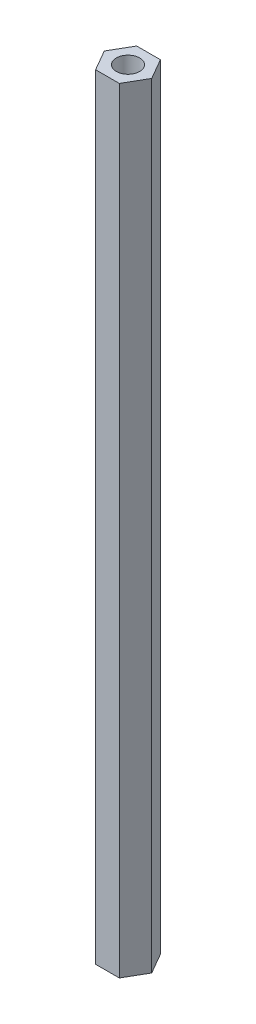
ISO-10303-21;
HEADER;
FILE_DESCRIPTION(('STEP AP214'),'2;1');
FILE_NAME('part.step','',(''),(''),'','','');
FILE_SCHEMA(('AUTOMOTIVE_DESIGN { 1 0 10303 214 1 1 1 1 }'));
ENDSEC;
DATA;
#1=APPLICATION_CONTEXT('core data for automotive mechanical design processes');
#2=APPLICATION_PROTOCOL_DEFINITION('international standard','automotive_design',2000,#1);
#3=PRODUCT_CONTEXT('',#1,'mechanical');
#4=PRODUCT('Part','Part','',(#3));
#5=PRODUCT_RELATED_PRODUCT_CATEGORY('part','',(#4));
#6=PRODUCT_DEFINITION_FORMATION('','',#4);
#7=PRODUCT_DEFINITION_CONTEXT('part definition',#1,'design');
#8=PRODUCT_DEFINITION('design','',#6,#7);
#9=PRODUCT_DEFINITION_SHAPE('','',#8);
#10=(LENGTH_UNIT() NAMED_UNIT(*) SI_UNIT(.MILLI.,.METRE.));
#11=(NAMED_UNIT(*) PLANE_ANGLE_UNIT() SI_UNIT($,.RADIAN.));
#12=(NAMED_UNIT(*) SI_UNIT($,.STERADIAN.) SOLID_ANGLE_UNIT());
#13=UNCERTAINTY_MEASURE_WITH_UNIT(LENGTH_MEASURE(1.E-05),#10,'distance_accuracy_value','');
#14=(GEOMETRIC_REPRESENTATION_CONTEXT(3) GLOBAL_UNCERTAINTY_ASSIGNED_CONTEXT((#13)) GLOBAL_UNIT_ASSIGNED_CONTEXT((#10,
#11,#12)) REPRESENTATION_CONTEXT('',''));
#15=CARTESIAN_POINT('',(0.,0.,0.));
#16=DIRECTION('',(0.,0.,1.));
#17=DIRECTION('',(1.,0.,0.));
#18=AXIS2_PLACEMENT_3D('',#15,#16,#17);
#19=CARTESIAN_POINT('',(0.,132.,0.));
#20=DIRECTION('',(0.,1.,0.));
#21=DIRECTION('',(0.,0.,1.));
#22=AXIS2_PLACEMENT_3D('',#19,#20,#21);
#23=PLANE('',#22);
#24=DIRECTION('',(0.499999999999999,0.,-0.866025403784439));
#25=VECTOR('',#24,1.);
#26=CARTESIAN_POINT('',(2.02072594216369,132.,3.5));
#27=LINE('',#26,#25);
#28=CARTESIAN_POINT('',(2.02072594216369,132.,3.5));
#29=VERTEX_POINT('',#28);
#30=CARTESIAN_POINT('',(4.04145188432738,132.,0.));
#31=VERTEX_POINT('',#30);
#32=EDGE_CURVE('E152',#29,#31,#27,.T.);
#33=ORIENTED_EDGE('',*,*,#32,.T.);
#34=DIRECTION('',(-0.5,0.,-0.866025403784438));
#35=VECTOR('',#34,1.);
#36=CARTESIAN_POINT('',(4.04145188432738,132.,0.));
#37=LINE('',#36,#35);
#38=CARTESIAN_POINT('',(2.02072594216369,132.,-3.5));
#39=VERTEX_POINT('',#38);
#40=EDGE_CURVE('E100',#31,#39,#37,.T.);
#41=ORIENTED_EDGE('',*,*,#40,.T.);
#42=DIRECTION('',(-1.,0.,0.));
#43=VECTOR('',#42,1.);
#44=CARTESIAN_POINT('',(2.02072594216369,132.,-3.5));
#45=LINE('',#44,#43);
#46=CARTESIAN_POINT('',(-2.02072594216369,132.,-3.5));
#47=VERTEX_POINT('',#46);
#48=EDGE_CURVE('E113',#39,#47,#45,.T.);
#49=ORIENTED_EDGE('',*,*,#48,.T.);
#50=DIRECTION('',(-0.5,0.,0.866025403784439));
#51=VECTOR('',#50,1.);
#52=CARTESIAN_POINT('',(-2.02072594216369,132.,-3.5));
#53=LINE('',#52,#51);
#54=CARTESIAN_POINT('',(-4.04145188432738,132.,0.));
#55=VERTEX_POINT('',#54);
#56=EDGE_CURVE('E107',#47,#55,#53,.T.);
#57=ORIENTED_EDGE('',*,*,#56,.T.);
#58=DIRECTION('',(0.5,0.,0.866025403784439));
#59=VECTOR('',#58,1.);
#60=CARTESIAN_POINT('',(-4.04145188432738,132.,0.));
#61=LINE('',#60,#59);
#62=CARTESIAN_POINT('',(-2.02072594216369,132.,3.5));
#63=VERTEX_POINT('',#62);
#64=EDGE_CURVE('E111',#55,#63,#61,.T.);
#65=ORIENTED_EDGE('',*,*,#64,.T.);
#66=DIRECTION('',(1.,0.,0.));
#67=VECTOR('',#66,1.);
#68=CARTESIAN_POINT('',(-2.02072594216369,132.,3.5));
#69=LINE('',#68,#67);
#70=EDGE_CURVE('E63',#63,#29,#69,.T.);
#71=ORIENTED_EDGE('',*,*,#70,.T.);
#72=EDGE_LOOP('',(#33,#41,#49,#57,#65,#71));
#73=FACE_BOUND('',#72,.T.);
#74=CARTESIAN_POINT('',(0.,132.,0.));
#75=DIRECTION('',(0.,1.,0.));
#76=DIRECTION('',(0.,0.,1.));
#77=AXIS2_PLACEMENT_3D('',#74,#75,#76);
#78=CIRCLE('',#77,2.);
#79=CARTESIAN_POINT('',(0.,132.,2.));
#80=VERTEX_POINT('',#79);
#81=EDGE_CURVE('E140',#80,#80,#78,.T.);
#82=ORIENTED_EDGE('',*,*,#81,.F.);
#83=EDGE_LOOP('',(#82));
#84=FACE_BOUND('',#83,.T.);
#85=ADVANCED_FACE('F45',(#73,#84),#23,.T.);
#86=CARTESIAN_POINT('',(0.,0.,0.));
#87=DIRECTION('',(0.,1.,0.));
#88=DIRECTION('',(0.,0.,1.));
#89=AXIS2_PLACEMENT_3D('',#86,#87,#88);
#90=PLANE('',#89);
#91=DIRECTION('',(0.499999999999999,0.,-0.866025403784439));
#92=VECTOR('',#91,1.);
#93=CARTESIAN_POINT('',(2.02072594216369,0.,3.5));
#94=LINE('',#93,#92);
#95=CARTESIAN_POINT('',(2.02072594216369,0.,3.5));
#96=VERTEX_POINT('',#95);
#97=CARTESIAN_POINT('',(4.04145188432738,0.,0.));
#98=VERTEX_POINT('',#97);
#99=EDGE_CURVE('E135',#96,#98,#94,.T.);
#100=ORIENTED_EDGE('',*,*,#99,.F.);
#101=DIRECTION('',(1.,0.,0.));
#102=VECTOR('',#101,1.);
#103=CARTESIAN_POINT('',(-2.02072594216369,0.,3.5));
#104=LINE('',#103,#102);
#105=CARTESIAN_POINT('',(-2.02072594216369,0.,3.5));
#106=VERTEX_POINT('',#105);
#107=EDGE_CURVE('E92',#106,#96,#104,.T.);
#108=ORIENTED_EDGE('',*,*,#107,.F.);
#109=DIRECTION('',(0.5,0.,0.866025403784439));
#110=VECTOR('',#109,1.);
#111=CARTESIAN_POINT('',(-4.04145188432738,0.,0.));
#112=LINE('',#111,#110);
#113=CARTESIAN_POINT('',(-4.04145188432738,0.,0.));
#114=VERTEX_POINT('',#113);
#115=EDGE_CURVE('E86',#114,#106,#112,.T.);
#116=ORIENTED_EDGE('',*,*,#115,.F.);
#117=DIRECTION('',(-0.5,0.,0.866025403784439));
#118=VECTOR('',#117,1.);
#119=CARTESIAN_POINT('',(-2.02072594216369,0.,-3.5));
#120=LINE('',#119,#118);
#121=CARTESIAN_POINT('',(-2.02072594216369,0.,-3.5));
#122=VERTEX_POINT('',#121);
#123=EDGE_CURVE('E122',#122,#114,#120,.T.);
#124=ORIENTED_EDGE('',*,*,#123,.F.);
#125=DIRECTION('',(-1.,0.,0.));
#126=VECTOR('',#125,1.);
#127=CARTESIAN_POINT('',(2.02072594216369,0.,-3.5));
#128=LINE('',#127,#126);
#129=CARTESIAN_POINT('',(2.02072594216369,0.,-3.5));
#130=VERTEX_POINT('',#129);
#131=EDGE_CURVE('E143',#130,#122,#128,.T.);
#132=ORIENTED_EDGE('',*,*,#131,.F.);
#133=DIRECTION('',(-0.5,0.,-0.866025403784438));
#134=VECTOR('',#133,1.);
#135=CARTESIAN_POINT('',(4.04145188432738,0.,0.));
#136=LINE('',#135,#134);
#137=EDGE_CURVE('E139',#98,#130,#136,.T.);
#138=ORIENTED_EDGE('',*,*,#137,.F.);
#139=EDGE_LOOP('',(#100,#108,#116,#124,#132,#138));
#140=FACE_BOUND('',#139,.T.);
#141=CARTESIAN_POINT('',(0.,0.,0.));
#142=DIRECTION('',(0.,1.,0.));
#143=DIRECTION('',(0.,0.,1.));
#144=AXIS2_PLACEMENT_3D('',#141,#142,#143);
#145=CIRCLE('',#144,2.);
#146=CARTESIAN_POINT('',(0.,0.,2.));
#147=VERTEX_POINT('',#146);
#148=EDGE_CURVE('E249',#147,#147,#145,.T.);
#149=ORIENTED_EDGE('',*,*,#148,.T.);
#150=EDGE_LOOP('',(#149));
#151=FACE_BOUND('',#150,.T.);
#152=ADVANCED_FACE('F165',(#140,#151),#90,.F.);
#153=CARTESIAN_POINT('',(2.02072594216369,132.,3.5));
#154=DIRECTION('',(-0.866025403784439,0.,-0.499999999999999));
#155=DIRECTION('',(-0.499999999999999,0.,0.866025403784439));
#156=AXIS2_PLACEMENT_3D('',#153,#154,#155);
#157=PLANE('',#156);
#158=ORIENTED_EDGE('',*,*,#99,.T.);
#159=DIRECTION('',(0.,-1.,0.));
#160=VECTOR('',#159,1.);
#161=CARTESIAN_POINT('',(4.04145188432738,132.,0.));
#162=LINE('',#161,#160);
#163=EDGE_CURVE('E11',#31,#98,#162,.T.);
#164=ORIENTED_EDGE('',*,*,#163,.F.);
#165=ORIENTED_EDGE('',*,*,#32,.F.);
#166=DIRECTION('',(0.,-1.,0.));
#167=VECTOR('',#166,1.);
#168=CARTESIAN_POINT('',(2.02072594216369,132.,3.5));
#169=LINE('',#168,#167);
#170=EDGE_CURVE('E131',#29,#96,#169,.T.);
#171=ORIENTED_EDGE('',*,*,#170,.T.);
#172=EDGE_LOOP('',(#158,#164,#165,#171));
#173=FACE_BOUND('',#172,.T.);
#174=ADVANCED_FACE('F47',(#173),#157,.F.);
#175=CARTESIAN_POINT('',(4.04145188432738,132.,0.));
#176=DIRECTION('',(-0.866025403784439,0.,0.5));
#177=DIRECTION('',(0.5,0.,0.866025403784439));
#178=AXIS2_PLACEMENT_3D('',#175,#176,#177);
#179=PLANE('',#178);
#180=ORIENTED_EDGE('',*,*,#137,.T.);
#181=DIRECTION('',(0.,-1.,0.));
#182=VECTOR('',#181,1.);
#183=CARTESIAN_POINT('',(2.02072594216369,132.,-3.5));
#184=LINE('',#183,#182);
#185=EDGE_CURVE('E55',#39,#130,#184,.T.);
#186=ORIENTED_EDGE('',*,*,#185,.F.);
#187=ORIENTED_EDGE('',*,*,#40,.F.);
#188=ORIENTED_EDGE('',*,*,#163,.T.);
#189=EDGE_LOOP('',(#180,#186,#187,#188));
#190=FACE_BOUND('',#189,.T.);
#191=ADVANCED_FACE('F190',(#190),#179,.F.);
#192=CARTESIAN_POINT('',(2.02072594216369,132.,-3.5));
#193=DIRECTION('',(0.,0.,1.));
#194=DIRECTION('',(1.,0.,0.));
#195=AXIS2_PLACEMENT_3D('',#192,#193,#194);
#196=PLANE('',#195);
#197=ORIENTED_EDGE('',*,*,#131,.T.);
#198=DIRECTION('',(0.,-1.,0.));
#199=VECTOR('',#198,1.);
#200=CARTESIAN_POINT('',(-2.02072594216369,132.,-3.5));
#201=LINE('',#200,#199);
#202=EDGE_CURVE('E124',#47,#122,#201,.T.);
#203=ORIENTED_EDGE('',*,*,#202,.F.);
#204=ORIENTED_EDGE('',*,*,#48,.F.);
#205=ORIENTED_EDGE('',*,*,#185,.T.);
#206=EDGE_LOOP('',(#197,#203,#204,#205));
#207=FACE_BOUND('',#206,.T.);
#208=ADVANCED_FACE('F162',(#207),#196,.F.);
#209=CARTESIAN_POINT('',(-2.02072594216369,132.,-3.5));
#210=DIRECTION('',(0.866025403784439,0.,0.499999999999999));
#211=DIRECTION('',(0.5,0.,-0.866025403784439));
#212=AXIS2_PLACEMENT_3D('',#209,#210,#211);
#213=PLANE('',#212);
#214=ORIENTED_EDGE('',*,*,#123,.T.);
#215=DIRECTION('',(0.,-1.,0.));
#216=VECTOR('',#215,1.);
#217=CARTESIAN_POINT('',(-4.04145188432738,132.,0.));
#218=LINE('',#217,#216);
#219=EDGE_CURVE('E119',#55,#114,#218,.T.);
#220=ORIENTED_EDGE('',*,*,#219,.F.);
#221=ORIENTED_EDGE('',*,*,#56,.F.);
#222=ORIENTED_EDGE('',*,*,#202,.T.);
#223=EDGE_LOOP('',(#214,#220,#221,#222));
#224=FACE_BOUND('',#223,.T.);
#225=ADVANCED_FACE('F120',(#224),#213,.F.);
#226=CARTESIAN_POINT('',(-4.04145188432738,132.,0.));
#227=DIRECTION('',(0.866025403784439,0.,-0.5));
#228=DIRECTION('',(-0.5,0.,-0.866025403784439));
#229=AXIS2_PLACEMENT_3D('',#226,#227,#228);
#230=PLANE('',#229);
#231=ORIENTED_EDGE('',*,*,#115,.T.);
#232=DIRECTION('',(0.,-1.,0.));
#233=VECTOR('',#232,1.);
#234=CARTESIAN_POINT('',(-2.02072594216369,132.,3.5));
#235=LINE('',#234,#233);
#236=EDGE_CURVE('E125',#63,#106,#235,.T.);
#237=ORIENTED_EDGE('',*,*,#236,.F.);
#238=ORIENTED_EDGE('',*,*,#64,.F.);
#239=ORIENTED_EDGE('',*,*,#219,.T.);
#240=EDGE_LOOP('',(#231,#237,#238,#239));
#241=FACE_BOUND('',#240,.T.);
#242=ADVANCED_FACE('F127',(#241),#230,.F.);
#243=CARTESIAN_POINT('',(-2.02072594216369,132.,3.5));
#244=DIRECTION('',(0.,0.,-1.));
#245=DIRECTION('',(-1.,0.,0.));
#246=AXIS2_PLACEMENT_3D('',#243,#244,#245);
#247=PLANE('',#246);
#248=ORIENTED_EDGE('',*,*,#107,.T.);
#249=ORIENTED_EDGE('',*,*,#170,.F.);
#250=ORIENTED_EDGE('',*,*,#70,.F.);
#251=ORIENTED_EDGE('',*,*,#236,.T.);
#252=EDGE_LOOP('',(#248,#249,#250,#251));
#253=FACE_BOUND('',#252,.T.);
#254=ADVANCED_FACE('F170',(#253),#247,.F.);
#255=CARTESIAN_POINT('',(0.,132.,0.));
#256=DIRECTION('',(0.,-1.,0.));
#257=DIRECTION('',(0.,0.,-1.));
#258=AXIS2_PLACEMENT_3D('',#255,#256,#257);
#259=CYLINDRICAL_SURFACE('',#258,2.);
#260=ORIENTED_EDGE('',*,*,#81,.T.);
#261=EDGE_LOOP('',(#260));
#262=FACE_BOUND('',#261,.T.);
#263=ORIENTED_EDGE('',*,*,#148,.F.);
#264=EDGE_LOOP('',(#263));
#265=FACE_BOUND('',#264,.T.);
#266=ADVANCED_FACE('F172',(#262,#265),#259,.F.);
#267=CLOSED_SHELL('',(#85,#152,#174,#191,#208,#225,#242,#254,#266));
#268=MANIFOLD_SOLID_BREP('B2',#267);
#269=ADVANCED_BREP_SHAPE_REPRESENTATION('',(#18,#268),#14);
#270=SHAPE_DEFINITION_REPRESENTATION(#9,#269);
ENDSEC;
END-ISO-10303-21;
